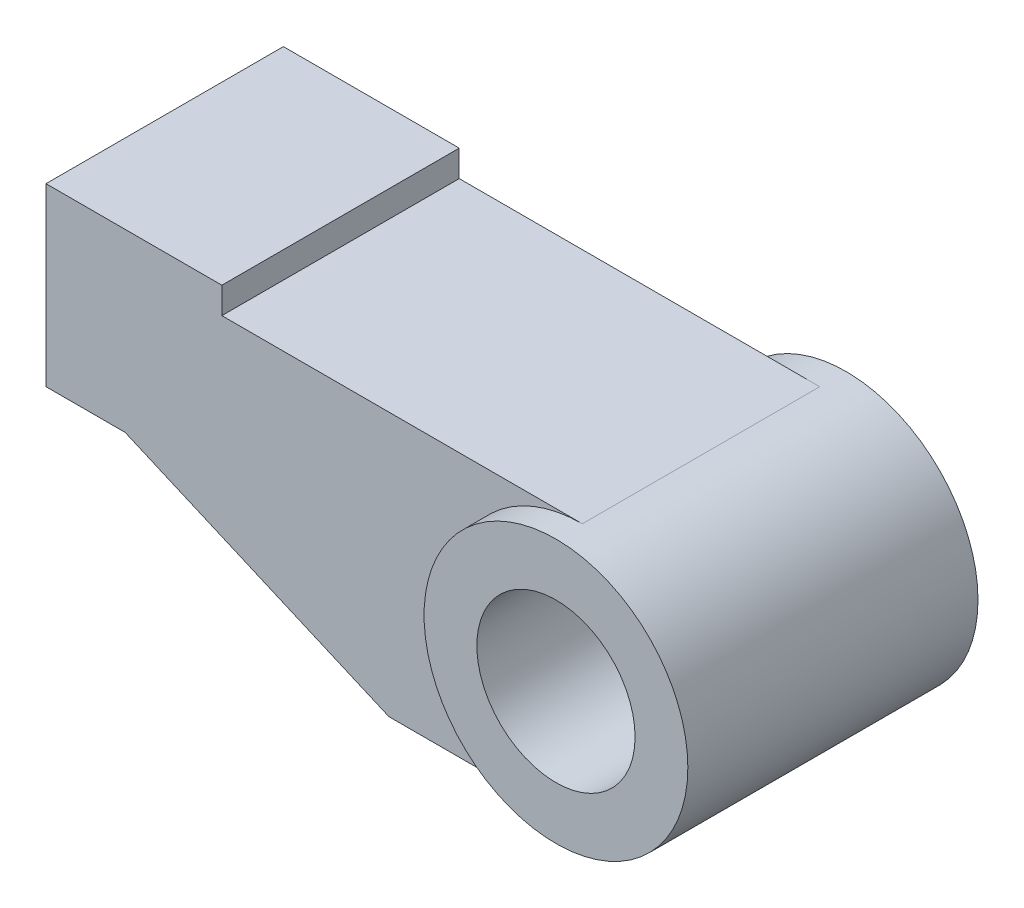
ISO-10303-21;
HEADER;
FILE_DESCRIPTION(('STEP AP214'),'2;1');
FILE_NAME('part.step','',(''),(''),'','','');
FILE_SCHEMA(('AUTOMOTIVE_DESIGN { 1 0 10303 214 1 1 1 1 }'));
ENDSEC;
DATA;
#1=APPLICATION_CONTEXT('core data for automotive mechanical design processes');
#2=APPLICATION_PROTOCOL_DEFINITION('international standard','automotive_design',2000,#1);
#3=PRODUCT_CONTEXT('',#1,'mechanical');
#4=PRODUCT('Part','Part','',(#3));
#5=PRODUCT_RELATED_PRODUCT_CATEGORY('part','',(#4));
#6=PRODUCT_DEFINITION_FORMATION('','',#4);
#7=PRODUCT_DEFINITION_CONTEXT('part definition',#1,'design');
#8=PRODUCT_DEFINITION('design','',#6,#7);
#9=PRODUCT_DEFINITION_SHAPE('','',#8);
#10=(LENGTH_UNIT() NAMED_UNIT(*) SI_UNIT(.MILLI.,.METRE.));
#11=(NAMED_UNIT(*) PLANE_ANGLE_UNIT() SI_UNIT($,.RADIAN.));
#12=(NAMED_UNIT(*) SI_UNIT($,.STERADIAN.) SOLID_ANGLE_UNIT());
#13=UNCERTAINTY_MEASURE_WITH_UNIT(LENGTH_MEASURE(1.E-05),#10,'distance_accuracy_value','');
#14=(GEOMETRIC_REPRESENTATION_CONTEXT(3) GLOBAL_UNCERTAINTY_ASSIGNED_CONTEXT((#13)) GLOBAL_UNIT_ASSIGNED_CONTEXT((#10,
#11,#12)) REPRESENTATION_CONTEXT('',''));
#15=CARTESIAN_POINT('',(0.,0.,0.));
#16=DIRECTION('',(0.,0.,1.));
#17=DIRECTION('',(1.,0.,0.));
#18=AXIS2_PLACEMENT_3D('',#15,#16,#17);
#19=CARTESIAN_POINT('',(0.,0.,27.));
#20=DIRECTION('',(0.,0.,1.));
#21=DIRECTION('',(1.,0.,0.));
#22=AXIS2_PLACEMENT_3D('',#19,#20,#21);
#23=PLANE('',#22);
#24=DIRECTION('',(1.,0.,0.));
#25=VECTOR('',#24,1.);
#26=CARTESIAN_POINT('',(0.,-30.,27.));
#27=LINE('',#26,#25);
#28=CARTESIAN_POINT('',(-44.,-30.,27.));
#29=VERTEX_POINT('',#28);
#30=CARTESIAN_POINT('',(0.,-30.,27.));
#31=VERTEX_POINT('',#30);
#32=EDGE_CURVE('E100',#29,#31,#27,.T.);
#33=ORIENTED_EDGE('',*,*,#32,.T.);
#34=CARTESIAN_POINT('',(0.,0.,27.));
#35=DIRECTION('',(0.,0.,1.));
#36=DIRECTION('',(1.,0.,0.));
#37=AXIS2_PLACEMENT_3D('',#34,#35,#36);
#38=CIRCLE('',#37,30.);
#39=CARTESIAN_POINT('',(0.,30.,27.));
#40=VERTEX_POINT('',#39);
#41=EDGE_CURVE('E146',#31,#40,#38,.F.);
#42=ORIENTED_EDGE('',*,*,#41,.T.);
#43=DIRECTION('',(-1.,0.,0.));
#44=VECTOR('',#43,1.);
#45=CARTESIAN_POINT('',(0.,30.,27.));
#46=LINE('',#45,#44);
#47=CARTESIAN_POINT('',(-82.,30.,27.));
#48=VERTEX_POINT('',#47);
#49=EDGE_CURVE('E205',#40,#48,#46,.T.);
#50=ORIENTED_EDGE('',*,*,#49,.T.);
#51=DIRECTION('',(0.,1.,0.));
#52=VECTOR('',#51,1.);
#53=CARTESIAN_POINT('',(-82.,0.,27.));
#54=LINE('',#53,#52);
#55=CARTESIAN_POINT('',(-82.,36.,27.));
#56=VERTEX_POINT('',#55);
#57=EDGE_CURVE('E203',#48,#56,#54,.T.);
#58=ORIENTED_EDGE('',*,*,#57,.T.);
#59=DIRECTION('',(-1.,0.,0.));
#60=VECTOR('',#59,1.);
#61=CARTESIAN_POINT('',(0.,36.,27.));
#62=LINE('',#61,#60);
#63=CARTESIAN_POINT('',(-122.,36.,27.));
#64=VERTEX_POINT('',#63);
#65=EDGE_CURVE('E119',#56,#64,#62,.T.);
#66=ORIENTED_EDGE('',*,*,#65,.T.);
#67=DIRECTION('',(0.,-1.,0.));
#68=VECTOR('',#67,1.);
#69=CARTESIAN_POINT('',(-122.,0.,27.));
#70=LINE('',#69,#68);
#71=CARTESIAN_POINT('',(-122.,-4.00000000000002,27.));
#72=VERTEX_POINT('',#71);
#73=EDGE_CURVE('E114',#64,#72,#70,.T.);
#74=ORIENTED_EDGE('',*,*,#73,.T.);
#75=DIRECTION('',(1.,0.,0.));
#76=VECTOR('',#75,1.);
#77=CARTESIAN_POINT('',(0.,-4.00000000000002,27.));
#78=LINE('',#77,#76);
#79=CARTESIAN_POINT('',(-104.,-4.00000000000002,27.));
#80=VERTEX_POINT('',#79);
#81=EDGE_CURVE('E117',#72,#80,#78,.T.);
#82=ORIENTED_EDGE('',*,*,#81,.T.);
#83=DIRECTION('',(0.917555625309924,-0.3976074376343,0.));
#84=VECTOR('',#83,1.);
#85=CARTESIAN_POINT('',(-17.9008419083255,-41.3096351730589,27.));
#86=LINE('',#85,#84);
#87=EDGE_CURVE('E62',#80,#29,#86,.T.);
#88=ORIENTED_EDGE('',*,*,#87,.T.);
#89=EDGE_LOOP('',(#33,#42,#50,#58,#66,#74,#82,#88));
#90=FACE_BOUND('',#89,.T.);
#91=ADVANCED_FACE('F43',(#90),#23,.T.);
#92=CARTESIAN_POINT('',(0.,0.,-27.));
#93=DIRECTION('',(0.,0.,1.));
#94=DIRECTION('',(1.,0.,0.));
#95=AXIS2_PLACEMENT_3D('',#92,#93,#94);
#96=PLANE('',#95);
#97=CARTESIAN_POINT('',(0.,0.,-27.));
#98=DIRECTION('',(0.,0.,1.));
#99=DIRECTION('',(1.,0.,0.));
#100=AXIS2_PLACEMENT_3D('',#97,#98,#99);
#101=CIRCLE('',#100,30.);
#102=CARTESIAN_POINT('',(0.,-30.,-27.));
#103=VERTEX_POINT('',#102);
#104=CARTESIAN_POINT('',(0.,30.,-27.));
#105=VERTEX_POINT('',#104);
#106=EDGE_CURVE('E11',#103,#105,#101,.F.);
#107=ORIENTED_EDGE('',*,*,#106,.F.);
#108=DIRECTION('',(1.,0.,0.));
#109=VECTOR('',#108,1.);
#110=CARTESIAN_POINT('',(0.,-30.,-27.));
#111=LINE('',#110,#109);
#112=CARTESIAN_POINT('',(-44.,-30.,-27.));
#113=VERTEX_POINT('',#112);
#114=EDGE_CURVE('E141',#113,#103,#111,.T.);
#115=ORIENTED_EDGE('',*,*,#114,.F.);
#116=DIRECTION('',(0.917555625309924,-0.3976074376343,0.));
#117=VECTOR('',#116,1.);
#118=CARTESIAN_POINT('',(-17.9008419083255,-41.3096351730589,-27.));
#119=LINE('',#118,#117);
#120=CARTESIAN_POINT('',(-104.,-4.00000000000002,-27.));
#121=VERTEX_POINT('',#120);
#122=EDGE_CURVE('E94',#121,#113,#119,.T.);
#123=ORIENTED_EDGE('',*,*,#122,.F.);
#124=DIRECTION('',(1.,0.,0.));
#125=VECTOR('',#124,1.);
#126=CARTESIAN_POINT('',(0.,-4.00000000000002,-27.));
#127=LINE('',#126,#125);
#128=CARTESIAN_POINT('',(-122.,-4.00000000000002,-27.));
#129=VERTEX_POINT('',#128);
#130=EDGE_CURVE('E88',#129,#121,#127,.T.);
#131=ORIENTED_EDGE('',*,*,#130,.F.);
#132=DIRECTION('',(0.,-1.,0.));
#133=VECTOR('',#132,1.);
#134=CARTESIAN_POINT('',(-122.,0.,-27.));
#135=LINE('',#134,#133);
#136=CARTESIAN_POINT('',(-122.,36.,-27.));
#137=VERTEX_POINT('',#136);
#138=EDGE_CURVE('E128',#137,#129,#135,.T.);
#139=ORIENTED_EDGE('',*,*,#138,.F.);
#140=DIRECTION('',(-1.,0.,0.));
#141=VECTOR('',#140,1.);
#142=CARTESIAN_POINT('',(0.,36.,-27.));
#143=LINE('',#142,#141);
#144=CARTESIAN_POINT('',(-82.,36.,-27.));
#145=VERTEX_POINT('',#144);
#146=EDGE_CURVE('E152',#145,#137,#143,.T.);
#147=ORIENTED_EDGE('',*,*,#146,.F.);
#148=DIRECTION('',(0.,1.,0.));
#149=VECTOR('',#148,1.);
#150=CARTESIAN_POINT('',(-82.,0.,-27.));
#151=LINE('',#150,#149);
#152=CARTESIAN_POINT('',(-82.,30.,-27.));
#153=VERTEX_POINT('',#152);
#154=EDGE_CURVE('E149',#153,#145,#151,.T.);
#155=ORIENTED_EDGE('',*,*,#154,.F.);
#156=DIRECTION('',(-1.,0.,0.));
#157=VECTOR('',#156,1.);
#158=CARTESIAN_POINT('',(0.,30.,-27.));
#159=LINE('',#158,#157);
#160=EDGE_CURVE('E145',#105,#153,#159,.T.);
#161=ORIENTED_EDGE('',*,*,#160,.F.);
#162=EDGE_LOOP('',(#107,#115,#123,#131,#139,#147,#155,#161));
#163=FACE_BOUND('',#162,.T.);
#164=ADVANCED_FACE('F191',(#163),#96,.F.);
#165=CARTESIAN_POINT('',(0.,-30.,27.));
#166=DIRECTION('',(0.,1.,0.));
#167=DIRECTION('',(-1.,0.,0.));
#168=AXIS2_PLACEMENT_3D('',#165,#166,#167);
#169=PLANE('',#168);
#170=ORIENTED_EDGE('',*,*,#114,.T.);
#171=DIRECTION('',(0.,0.,-1.));
#172=VECTOR('',#171,1.);
#173=CARTESIAN_POINT('',(0.,-30.,27.));
#174=LINE('',#173,#172);
#175=EDGE_CURVE('E54',#31,#103,#174,.T.);
#176=ORIENTED_EDGE('',*,*,#175,.F.);
#177=ORIENTED_EDGE('',*,*,#32,.F.);
#178=DIRECTION('',(0.,0.,-1.));
#179=VECTOR('',#178,1.);
#180=CARTESIAN_POINT('',(-44.,-30.,27.));
#181=LINE('',#180,#179);
#182=EDGE_CURVE('E137',#29,#113,#181,.T.);
#183=ORIENTED_EDGE('',*,*,#182,.T.);
#184=EDGE_LOOP('',(#170,#176,#177,#183));
#185=FACE_BOUND('',#184,.T.);
#186=ADVANCED_FACE('F45',(#185),#169,.F.);
#187=CARTESIAN_POINT('',(0.,0.,27.));
#188=DIRECTION('',(0.,0.,-1.));
#189=DIRECTION('',(-1.,0.,0.));
#190=AXIS2_PLACEMENT_3D('',#187,#188,#189);
#191=CYLINDRICAL_SURFACE('',#190,30.);
#192=ORIENTED_EDGE('',*,*,#175,.T.);
#193=ORIENTED_EDGE('',*,*,#106,.T.);
#194=DIRECTION('',(0.,0.,-1.));
#195=VECTOR('',#194,1.);
#196=CARTESIAN_POINT('',(0.,30.,27.));
#197=LINE('',#196,#195);
#198=EDGE_CURVE('E175',#40,#105,#197,.T.);
#199=ORIENTED_EDGE('',*,*,#198,.F.);
#200=ORIENTED_EDGE('',*,*,#41,.F.);
#201=EDGE_LOOP('',(#192,#193,#199,#200));
#202=FACE_BOUND('',#201,.T.);
#203=CARTESIAN_POINT('',(0.,0.,-33.));
#204=DIRECTION('',(0.,0.,1.));
#205=DIRECTION('',(1.,0.,0.));
#206=AXIS2_PLACEMENT_3D('',#203,#204,#205);
#207=CIRCLE('',#206,30.);
#208=CARTESIAN_POINT('',(30.,0.,-33.));
#209=VERTEX_POINT('',#208);
#210=EDGE_CURVE('E216',#209,#209,#207,.T.);
#211=ORIENTED_EDGE('',*,*,#210,.T.);
#212=EDGE_LOOP('',(#211));
#213=FACE_BOUND('',#212,.T.);
#214=CARTESIAN_POINT('',(0.,0.,33.));
#215=DIRECTION('',(0.,0.,1.));
#216=DIRECTION('',(1.,0.,0.));
#217=AXIS2_PLACEMENT_3D('',#214,#215,#216);
#218=CIRCLE('',#217,30.);
#219=CARTESIAN_POINT('',(30.,0.,33.));
#220=VERTEX_POINT('',#219);
#221=EDGE_CURVE('E215',#220,#220,#218,.T.);
#222=ORIENTED_EDGE('',*,*,#221,.F.);
#223=EDGE_LOOP('',(#222));
#224=FACE_BOUND('',#223,.T.);
#225=ADVANCED_FACE('F184',(#202,#213,#224),#191,.T.);
#226=CARTESIAN_POINT('',(0.,30.,27.));
#227=DIRECTION('',(0.,-1.,0.));
#228=DIRECTION('',(1.,0.,0.));
#229=AXIS2_PLACEMENT_3D('',#226,#227,#228);
#230=PLANE('',#229);
#231=ORIENTED_EDGE('',*,*,#160,.T.);
#232=DIRECTION('',(0.,0.,-1.));
#233=VECTOR('',#232,1.);
#234=CARTESIAN_POINT('',(-82.,30.,27.));
#235=LINE('',#234,#233);
#236=EDGE_CURVE('E171',#48,#153,#235,.T.);
#237=ORIENTED_EDGE('',*,*,#236,.F.);
#238=ORIENTED_EDGE('',*,*,#49,.F.);
#239=ORIENTED_EDGE('',*,*,#198,.T.);
#240=EDGE_LOOP('',(#231,#237,#238,#239));
#241=FACE_BOUND('',#240,.T.);
#242=ADVANCED_FACE('F197',(#241),#230,.F.);
#243=CARTESIAN_POINT('',(-82.,0.,27.));
#244=DIRECTION('',(-1.,0.,0.));
#245=DIRECTION('',(0.,0.,1.));
#246=AXIS2_PLACEMENT_3D('',#243,#244,#245);
#247=PLANE('',#246);
#248=ORIENTED_EDGE('',*,*,#154,.T.);
#249=DIRECTION('',(0.,0.,-1.));
#250=VECTOR('',#249,1.);
#251=CARTESIAN_POINT('',(-82.,36.,27.));
#252=LINE('',#251,#250);
#253=EDGE_CURVE('E167',#56,#145,#252,.T.);
#254=ORIENTED_EDGE('',*,*,#253,.F.);
#255=ORIENTED_EDGE('',*,*,#57,.F.);
#256=ORIENTED_EDGE('',*,*,#236,.T.);
#257=EDGE_LOOP('',(#248,#254,#255,#256));
#258=FACE_BOUND('',#257,.T.);
#259=ADVANCED_FACE('F201',(#258),#247,.F.);
#260=CARTESIAN_POINT('',(0.,36.,27.));
#261=DIRECTION('',(0.,-1.,0.));
#262=DIRECTION('',(0.,0.,-1.));
#263=AXIS2_PLACEMENT_3D('',#260,#261,#262);
#264=PLANE('',#263);
#265=ORIENTED_EDGE('',*,*,#146,.T.);
#266=DIRECTION('',(0.,0.,-1.));
#267=VECTOR('',#266,1.);
#268=CARTESIAN_POINT('',(-122.,36.,27.));
#269=LINE('',#268,#267);
#270=EDGE_CURVE('E130',#64,#137,#269,.T.);
#271=ORIENTED_EDGE('',*,*,#270,.F.);
#272=ORIENTED_EDGE('',*,*,#65,.F.);
#273=ORIENTED_EDGE('',*,*,#253,.T.);
#274=EDGE_LOOP('',(#265,#271,#272,#273));
#275=FACE_BOUND('',#274,.T.);
#276=ADVANCED_FACE('F258',(#275),#264,.F.);
#277=CARTESIAN_POINT('',(-122.,0.,27.));
#278=DIRECTION('',(1.,0.,0.));
#279=DIRECTION('',(0.,0.,-1.));
#280=AXIS2_PLACEMENT_3D('',#277,#278,#279);
#281=PLANE('',#280);
#282=ORIENTED_EDGE('',*,*,#138,.T.);
#283=DIRECTION('',(0.,0.,-1.));
#284=VECTOR('',#283,1.);
#285=CARTESIAN_POINT('',(-122.,-4.00000000000002,27.));
#286=LINE('',#285,#284);
#287=EDGE_CURVE('E125',#72,#129,#286,.T.);
#288=ORIENTED_EDGE('',*,*,#287,.F.);
#289=ORIENTED_EDGE('',*,*,#73,.F.);
#290=ORIENTED_EDGE('',*,*,#270,.T.);
#291=EDGE_LOOP('',(#282,#288,#289,#290));
#292=FACE_BOUND('',#291,.T.);
#293=ADVANCED_FACE('F126',(#292),#281,.F.);
#294=CARTESIAN_POINT('',(0.,-4.00000000000002,27.));
#295=DIRECTION('',(0.,1.,0.));
#296=DIRECTION('',(0.,0.,1.));
#297=AXIS2_PLACEMENT_3D('',#294,#295,#296);
#298=PLANE('',#297);
#299=ORIENTED_EDGE('',*,*,#130,.T.);
#300=DIRECTION('',(0.,0.,-1.));
#301=VECTOR('',#300,1.);
#302=CARTESIAN_POINT('',(-104.,-4.00000000000002,27.));
#303=LINE('',#302,#301);
#304=EDGE_CURVE('E131',#80,#121,#303,.T.);
#305=ORIENTED_EDGE('',*,*,#304,.F.);
#306=ORIENTED_EDGE('',*,*,#81,.F.);
#307=ORIENTED_EDGE('',*,*,#287,.T.);
#308=EDGE_LOOP('',(#299,#305,#306,#307));
#309=FACE_BOUND('',#308,.T.);
#310=ADVANCED_FACE('F133',(#309),#298,.F.);
#311=CARTESIAN_POINT('',(-17.9008419083255,-41.3096351730589,27.));
#312=DIRECTION('',(0.3976074376343,0.917555625309924,0.));
#313=DIRECTION('',(-0.917555625309924,0.3976074376343,0.));
#314=AXIS2_PLACEMENT_3D('',#311,#312,#313);
#315=PLANE('',#314);
#316=ORIENTED_EDGE('',*,*,#122,.T.);
#317=ORIENTED_EDGE('',*,*,#182,.F.);
#318=ORIENTED_EDGE('',*,*,#87,.F.);
#319=ORIENTED_EDGE('',*,*,#304,.T.);
#320=EDGE_LOOP('',(#316,#317,#318,#319));
#321=FACE_BOUND('',#320,.T.);
#322=ADVANCED_FACE('F251',(#321),#315,.F.);
#323=CARTESIAN_POINT('',(0.,0.,-33.));
#324=DIRECTION('',(0.,0.,1.));
#325=DIRECTION('',(1.,0.,0.));
#326=AXIS2_PLACEMENT_3D('',#323,#324,#325);
#327=PLANE('',#326);
#328=CARTESIAN_POINT('',(0.,0.,-33.));
#329=DIRECTION('',(0.,0.,1.));
#330=DIRECTION('',(1.,0.,0.));
#331=AXIS2_PLACEMENT_3D('',#328,#329,#330);
#332=CIRCLE('',#331,18.);
#333=CARTESIAN_POINT('',(18.,0.,-33.));
#334=VERTEX_POINT('',#333);
#335=EDGE_CURVE('E220',#334,#334,#332,.F.);
#336=ORIENTED_EDGE('',*,*,#335,.F.);
#337=EDGE_LOOP('',(#336));
#338=FACE_BOUND('',#337,.T.);
#339=ORIENTED_EDGE('',*,*,#210,.F.);
#340=EDGE_LOOP('',(#339));
#341=FACE_BOUND('',#340,.T.);
#342=ADVANCED_FACE('F241',(#338,#341),#327,.F.);
#343=CARTESIAN_POINT('',(0.,0.,33.));
#344=DIRECTION('',(0.,0.,1.));
#345=DIRECTION('',(1.,0.,0.));
#346=AXIS2_PLACEMENT_3D('',#343,#344,#345);
#347=PLANE('',#346);
#348=CARTESIAN_POINT('',(0.,0.,33.));
#349=DIRECTION('',(0.,0.,1.));
#350=DIRECTION('',(1.,0.,0.));
#351=AXIS2_PLACEMENT_3D('',#348,#349,#350);
#352=CIRCLE('',#351,18.);
#353=CARTESIAN_POINT('',(18.,0.,33.));
#354=VERTEX_POINT('',#353);
#355=EDGE_CURVE('E47',#354,#354,#352,.F.);
#356=ORIENTED_EDGE('',*,*,#355,.T.);
#357=EDGE_LOOP('',(#356));
#358=FACE_BOUND('',#357,.T.);
#359=ORIENTED_EDGE('',*,*,#221,.T.);
#360=EDGE_LOOP('',(#359));
#361=FACE_BOUND('',#360,.T.);
#362=ADVANCED_FACE('F232',(#358,#361),#347,.T.);
#363=CARTESIAN_POINT('',(0.,0.,66.));
#364=DIRECTION('',(0.,0.,-1.));
#365=DIRECTION('',(-1.,0.,0.));
#366=AXIS2_PLACEMENT_3D('',#363,#364,#365);
#367=CYLINDRICAL_SURFACE('',#366,18.);
#368=ORIENTED_EDGE('',*,*,#355,.F.);
#369=EDGE_LOOP('',(#368));
#370=FACE_BOUND('',#369,.T.);
#371=ORIENTED_EDGE('',*,*,#335,.T.);
#372=EDGE_LOOP('',(#371));
#373=FACE_BOUND('',#372,.T.);
#374=ADVANCED_FACE('F235',(#370,#373),#367,.F.);
#375=CLOSED_SHELL('',(#91,#164,#186,#225,#242,#259,#276,#293,#310,#322,#342,#362,#374));
#376=MANIFOLD_SOLID_BREP('B2',#375);
#377=ADVANCED_BREP_SHAPE_REPRESENTATION('',(#18,#376),#14);
#378=SHAPE_DEFINITION_REPRESENTATION(#9,#377);
ENDSEC;
END-ISO-10303-21;
